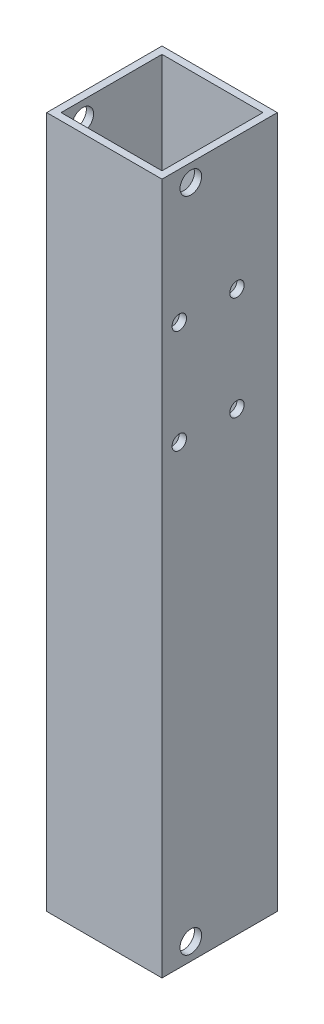
ISO-10303-21;
HEADER;
FILE_DESCRIPTION(('STEP AP214'),'2;1');
FILE_NAME('part.step','',(''),(''),'','','');
FILE_SCHEMA(('AUTOMOTIVE_DESIGN { 1 0 10303 214 1 1 1 1 }'));
ENDSEC;
DATA;
#1=APPLICATION_CONTEXT('core data for automotive mechanical design processes');
#2=APPLICATION_PROTOCOL_DEFINITION('international standard','automotive_design',2000,#1);
#3=PRODUCT_CONTEXT('',#1,'mechanical');
#4=PRODUCT('Part','Part','',(#3));
#5=PRODUCT_RELATED_PRODUCT_CATEGORY('part','',(#4));
#6=PRODUCT_DEFINITION_FORMATION('','',#4);
#7=PRODUCT_DEFINITION_CONTEXT('part definition',#1,'design');
#8=PRODUCT_DEFINITION('design','',#6,#7);
#9=PRODUCT_DEFINITION_SHAPE('','',#8);
#10=(LENGTH_UNIT() NAMED_UNIT(*) SI_UNIT(.MILLI.,.METRE.));
#11=(NAMED_UNIT(*) PLANE_ANGLE_UNIT() SI_UNIT($,.RADIAN.));
#12=(NAMED_UNIT(*) SI_UNIT($,.STERADIAN.) SOLID_ANGLE_UNIT());
#13=UNCERTAINTY_MEASURE_WITH_UNIT(LENGTH_MEASURE(1.E-05),#10,'distance_accuracy_value','');
#14=(GEOMETRIC_REPRESENTATION_CONTEXT(3) GLOBAL_UNCERTAINTY_ASSIGNED_CONTEXT((#13)) GLOBAL_UNIT_ASSIGNED_CONTEXT((#10,
#11,#12)) REPRESENTATION_CONTEXT('',''));
#15=CARTESIAN_POINT('',(0.,0.,0.));
#16=DIRECTION('',(0.,0.,1.));
#17=DIRECTION('',(1.,0.,0.));
#18=AXIS2_PLACEMENT_3D('',#15,#16,#17);
#19=CARTESIAN_POINT('',(63.3860498721177,-24.949645390071,25.4));
#20=DIRECTION('',(1.,0.,0.));
#21=DIRECTION('',(0.,1.,0.));
#22=AXIS2_PLACEMENT_3D('',#19,#20,#21);
#23=PLANE('',#22);
#24=CARTESIAN_POINT('',(63.3860498721177,-77.0196453900709,21.59));
#25=DIRECTION('',(1.,0.,0.));
#26=DIRECTION('',(0.,0.,-1.));
#27=AXIS2_PLACEMENT_3D('',#24,#25,#26);
#28=CIRCLE('',#27,1.58749999999999);
#29=CARTESIAN_POINT('',(63.3860498721177,-77.0196453900709,20.0025));
#30=VERTEX_POINT('',#29);
#31=EDGE_CURVE('E306',#30,#30,#28,.T.);
#32=ORIENTED_EDGE('',*,*,#31,.T.);
#33=EDGE_LOOP('',(#32));
#34=FACE_BOUND('',#33,.T.);
#35=CARTESIAN_POINT('',(63.3860498721177,-77.0196453900709,8.89));
#36=DIRECTION('',(1.,0.,0.));
#37=DIRECTION('',(0.,0.,-1.));
#38=AXIS2_PLACEMENT_3D('',#35,#36,#37);
#39=CIRCLE('',#38,1.58749999999999);
#40=CARTESIAN_POINT('',(63.3860498721177,-77.0196453900709,7.3025));
#41=VERTEX_POINT('',#40);
#42=EDGE_CURVE('E206',#41,#41,#39,.T.);
#43=ORIENTED_EDGE('',*,*,#42,.T.);
#44=EDGE_LOOP('',(#43));
#45=FACE_BOUND('',#44,.T.);
#46=CARTESIAN_POINT('',(63.3860498721177,-54.159645390071,21.59));
#47=DIRECTION('',(1.,0.,0.));
#48=DIRECTION('',(0.,0.,-1.));
#49=AXIS2_PLACEMENT_3D('',#46,#47,#48);
#50=CIRCLE('',#49,1.5875);
#51=CARTESIAN_POINT('',(63.3860498721177,-54.159645390071,20.0025));
#52=VERTEX_POINT('',#51);
#53=EDGE_CURVE('E228',#52,#52,#50,.T.);
#54=ORIENTED_EDGE('',*,*,#53,.T.);
#55=EDGE_LOOP('',(#54));
#56=FACE_BOUND('',#55,.T.);
#57=CARTESIAN_POINT('',(63.3860498721177,-54.159645390071,8.89));
#58=DIRECTION('',(1.,0.,0.));
#59=DIRECTION('',(0.,0.,-1.));
#60=AXIS2_PLACEMENT_3D('',#57,#58,#59);
#61=CIRCLE('',#60,1.5875);
#62=CARTESIAN_POINT('',(63.3860498721177,-54.159645390071,7.3025));
#63=VERTEX_POINT('',#62);
#64=EDGE_CURVE('E201',#63,#63,#61,.T.);
#65=ORIENTED_EDGE('',*,*,#64,.T.);
#66=EDGE_LOOP('',(#65));
#67=FACE_BOUND('',#66,.T.);
#68=CARTESIAN_POINT('',(63.3860498721177,-173.539645390071,19.05));
#69=DIRECTION('',(1.,0.,0.));
#70=DIRECTION('',(0.,0.,-1.));
#71=AXIS2_PLACEMENT_3D('',#68,#69,#70);
#72=CIRCLE('',#71,2.38125);
#73=CARTESIAN_POINT('',(63.3860498721177,-173.539645390071,16.66875));
#74=VERTEX_POINT('',#73);
#75=EDGE_CURVE('E196',#74,#74,#72,.T.);
#76=ORIENTED_EDGE('',*,*,#75,.T.);
#77=EDGE_LOOP('',(#76));
#78=FACE_BOUND('',#77,.T.);
#79=CARTESIAN_POINT('',(63.3860498721177,-28.759645390071,19.05));
#80=DIRECTION('',(1.,0.,0.));
#81=DIRECTION('',(0.,0.,-1.));
#82=AXIS2_PLACEMENT_3D('',#79,#80,#81);
#83=CIRCLE('',#82,2.38124999999999);
#84=CARTESIAN_POINT('',(63.3860498721177,-28.759645390071,16.66875));
#85=VERTEX_POINT('',#84);
#86=EDGE_CURVE('E264',#85,#85,#83,.T.);
#87=ORIENTED_EDGE('',*,*,#86,.T.);
#88=EDGE_LOOP('',(#87));
#89=FACE_BOUND('',#88,.T.);
#90=DIRECTION('',(0.,-1.,0.));
#91=VECTOR('',#90,1.);
#92=CARTESIAN_POINT('',(63.3860498721177,-24.949645390071,0.));
#93=LINE('',#92,#91);
#94=CARTESIAN_POINT('',(63.3860498721177,-24.949645390071,0.));
#95=VERTEX_POINT('',#94);
#96=CARTESIAN_POINT('',(63.3860498721177,-177.349645390071,0.));
#97=VERTEX_POINT('',#96);
#98=EDGE_CURVE('E154',#95,#97,#93,.T.);
#99=ORIENTED_EDGE('',*,*,#98,.T.);
#100=DIRECTION('',(0.,0.,-1.));
#101=VECTOR('',#100,1.);
#102=CARTESIAN_POINT('',(63.3860498721177,-177.349645390071,25.4));
#103=LINE('',#102,#101);
#104=CARTESIAN_POINT('',(63.3860498721177,-177.349645390071,25.4));
#105=VERTEX_POINT('',#104);
#106=EDGE_CURVE('E11',#105,#97,#103,.T.);
#107=ORIENTED_EDGE('',*,*,#106,.F.);
#108=DIRECTION('',(0.,-1.,0.));
#109=VECTOR('',#108,1.);
#110=CARTESIAN_POINT('',(63.3860498721177,-24.949645390071,25.4));
#111=LINE('',#110,#109);
#112=CARTESIAN_POINT('',(63.3860498721177,-24.949645390071,25.4));
#113=VERTEX_POINT('',#112);
#114=EDGE_CURVE('E155',#113,#105,#111,.T.);
#115=ORIENTED_EDGE('',*,*,#114,.F.);
#116=DIRECTION('',(0.,0.,-1.));
#117=VECTOR('',#116,1.);
#118=CARTESIAN_POINT('',(63.3860498721177,-24.949645390071,25.4));
#119=LINE('',#118,#117);
#120=EDGE_CURVE('E169',#113,#95,#119,.T.);
#121=ORIENTED_EDGE('',*,*,#120,.T.);
#122=EDGE_LOOP('',(#99,#107,#115,#121));
#123=FACE_BOUND('',#122,.T.);
#124=ADVANCED_FACE('F39',(#34,#45,#56,#67,#78,#89,#123),#23,.F.);
#125=CARTESIAN_POINT('',(63.3860498721177,-177.349645390071,25.4));
#126=DIRECTION('',(0.,1.,0.));
#127=DIRECTION('',(0.,0.,1.));
#128=AXIS2_PLACEMENT_3D('',#125,#126,#127);
#129=PLANE('',#128);
#130=DIRECTION('',(-1.,0.,0.));
#131=VECTOR('',#130,1.);
#132=CARTESIAN_POINT('',(63.3860498721177,-177.349645390071,1.58749999999999));
#133=LINE('',#132,#131);
#134=CARTESIAN_POINT('',(87.1985498721177,-177.349645390071,1.58750000000001));
#135=VERTEX_POINT('',#134);
#136=CARTESIAN_POINT('',(64.9735498721177,-177.349645390071,1.58750000000001));
#137=VERTEX_POINT('',#136);
#138=EDGE_CURVE('E146',#135,#137,#133,.T.);
#139=ORIENTED_EDGE('',*,*,#138,.T.);
#140=DIRECTION('',(0.,0.,1.));
#141=VECTOR('',#140,1.);
#142=CARTESIAN_POINT('',(64.9735498721177,-177.349645390071,25.4));
#143=LINE('',#142,#141);
#144=CARTESIAN_POINT('',(64.9735498721177,-177.349645390071,23.8125));
#145=VERTEX_POINT('',#144);
#146=EDGE_CURVE('E150',#137,#145,#143,.T.);
#147=ORIENTED_EDGE('',*,*,#146,.T.);
#148=DIRECTION('',(1.,0.,0.));
#149=VECTOR('',#148,1.);
#150=CARTESIAN_POINT('',(63.3860498721177,-177.349645390071,23.8125));
#151=LINE('',#150,#149);
#152=CARTESIAN_POINT('',(87.1985498721177,-177.349645390071,23.8125));
#153=VERTEX_POINT('',#152);
#154=EDGE_CURVE('E137',#145,#153,#151,.T.);
#155=ORIENTED_EDGE('',*,*,#154,.T.);
#156=DIRECTION('',(0.,0.,-1.));
#157=VECTOR('',#156,1.);
#158=CARTESIAN_POINT('',(87.1985498721177,-177.349645390071,25.4));
#159=LINE('',#158,#157);
#160=EDGE_CURVE('E112',#153,#135,#159,.T.);
#161=ORIENTED_EDGE('',*,*,#160,.T.);
#162=EDGE_LOOP('',(#139,#147,#155,#161));
#163=FACE_BOUND('',#162,.T.);
#164=DIRECTION('',(1.,0.,0.));
#165=VECTOR('',#164,1.);
#166=CARTESIAN_POINT('',(63.3860498721177,-177.349645390071,0.));
#167=LINE('',#166,#165);
#168=CARTESIAN_POINT('',(88.7860498721177,-177.349645390071,0.));
#169=VERTEX_POINT('',#168);
#170=EDGE_CURVE('E173',#97,#169,#167,.T.);
#171=ORIENTED_EDGE('',*,*,#170,.T.);
#172=DIRECTION('',(0.,0.,-1.));
#173=VECTOR('',#172,1.);
#174=CARTESIAN_POINT('',(88.7860498721177,-177.349645390071,25.4));
#175=LINE('',#174,#173);
#176=CARTESIAN_POINT('',(88.7860498721177,-177.349645390071,25.4));
#177=VERTEX_POINT('',#176);
#178=EDGE_CURVE('E48',#177,#169,#175,.T.);
#179=ORIENTED_EDGE('',*,*,#178,.F.);
#180=DIRECTION('',(1.,0.,0.));
#181=VECTOR('',#180,1.);
#182=CARTESIAN_POINT('',(63.3860498721177,-177.349645390071,25.4));
#183=LINE('',#182,#181);
#184=EDGE_CURVE('E159',#105,#177,#183,.T.);
#185=ORIENTED_EDGE('',*,*,#184,.F.);
#186=ORIENTED_EDGE('',*,*,#106,.T.);
#187=EDGE_LOOP('',(#171,#179,#185,#186));
#188=FACE_BOUND('',#187,.T.);
#189=ADVANCED_FACE('F297',(#163,#188),#129,.F.);
#190=CARTESIAN_POINT('',(88.7860498721177,-24.949645390071,25.4));
#191=DIRECTION('',(-1.,0.,0.));
#192=DIRECTION('',(0.,-1.,0.));
#193=AXIS2_PLACEMENT_3D('',#190,#191,#192);
#194=PLANE('',#193);
#195=CARTESIAN_POINT('',(88.7860498721177,-77.0196453900709,21.59));
#196=DIRECTION('',(1.,0.,0.));
#197=DIRECTION('',(0.,0.,-1.));
#198=AXIS2_PLACEMENT_3D('',#195,#196,#197);
#199=CIRCLE('',#198,1.58750000000001);
#200=CARTESIAN_POINT('',(88.7860498721177,-77.0196453900709,20.0025));
#201=VERTEX_POINT('',#200);
#202=EDGE_CURVE('E455',#201,#201,#199,.T.);
#203=ORIENTED_EDGE('',*,*,#202,.F.);
#204=EDGE_LOOP('',(#203));
#205=FACE_BOUND('',#204,.T.);
#206=CARTESIAN_POINT('',(88.7860498721177,-77.0196453900709,8.89));
#207=DIRECTION('',(1.,0.,0.));
#208=DIRECTION('',(0.,0.,-1.));
#209=AXIS2_PLACEMENT_3D('',#206,#207,#208);
#210=CIRCLE('',#209,1.58750000000001);
#211=CARTESIAN_POINT('',(88.7860498721177,-77.0196453900709,7.30249999999999));
#212=VERTEX_POINT('',#211);
#213=EDGE_CURVE('E215',#212,#212,#210,.T.);
#214=ORIENTED_EDGE('',*,*,#213,.F.);
#215=EDGE_LOOP('',(#214));
#216=FACE_BOUND('',#215,.T.);
#217=CARTESIAN_POINT('',(88.7860498721177,-54.159645390071,21.59));
#218=DIRECTION('',(1.,0.,0.));
#219=DIRECTION('',(0.,0.,-1.));
#220=AXIS2_PLACEMENT_3D('',#217,#218,#219);
#221=CIRCLE('',#220,1.5875);
#222=CARTESIAN_POINT('',(88.7860498721177,-54.159645390071,20.0025));
#223=VERTEX_POINT('',#222);
#224=EDGE_CURVE('E212',#223,#223,#221,.T.);
#225=ORIENTED_EDGE('',*,*,#224,.F.);
#226=EDGE_LOOP('',(#225));
#227=FACE_BOUND('',#226,.T.);
#228=CARTESIAN_POINT('',(88.7860498721177,-54.159645390071,8.89));
#229=DIRECTION('',(1.,0.,0.));
#230=DIRECTION('',(0.,0.,-1.));
#231=AXIS2_PLACEMENT_3D('',#228,#229,#230);
#232=CIRCLE('',#231,1.5875);
#233=CARTESIAN_POINT('',(88.7860498721177,-54.159645390071,7.3025));
#234=VERTEX_POINT('',#233);
#235=EDGE_CURVE('E240',#234,#234,#232,.T.);
#236=ORIENTED_EDGE('',*,*,#235,.F.);
#237=EDGE_LOOP('',(#236));
#238=FACE_BOUND('',#237,.T.);
#239=CARTESIAN_POINT('',(88.7860498721177,-173.539645390071,19.05));
#240=DIRECTION('',(1.,0.,0.));
#241=DIRECTION('',(0.,0.,-1.));
#242=AXIS2_PLACEMENT_3D('',#239,#240,#241);
#243=CIRCLE('',#242,2.38124999999997);
#244=CARTESIAN_POINT('',(88.7860498721177,-173.539645390071,16.66875));
#245=VERTEX_POINT('',#244);
#246=EDGE_CURVE('E250',#245,#245,#243,.T.);
#247=ORIENTED_EDGE('',*,*,#246,.F.);
#248=EDGE_LOOP('',(#247));
#249=FACE_BOUND('',#248,.T.);
#250=CARTESIAN_POINT('',(88.7860498721177,-28.759645390071,19.05));
#251=DIRECTION('',(1.,0.,0.));
#252=DIRECTION('',(0.,0.,-1.));
#253=AXIS2_PLACEMENT_3D('',#250,#251,#252);
#254=CIRCLE('',#253,2.38124999999999);
#255=CARTESIAN_POINT('',(88.7860498721177,-28.759645390071,16.66875));
#256=VERTEX_POINT('',#255);
#257=EDGE_CURVE('E260',#256,#256,#254,.T.);
#258=ORIENTED_EDGE('',*,*,#257,.F.);
#259=EDGE_LOOP('',(#258));
#260=FACE_BOUND('',#259,.T.);
#261=DIRECTION('',(0.,1.,0.));
#262=VECTOR('',#261,1.);
#263=CARTESIAN_POINT('',(88.7860498721177,-24.949645390071,0.));
#264=LINE('',#263,#262);
#265=CARTESIAN_POINT('',(88.7860498721177,-24.949645390071,0.));
#266=VERTEX_POINT('',#265);
#267=EDGE_CURVE('E176',#169,#266,#264,.T.);
#268=ORIENTED_EDGE('',*,*,#267,.T.);
#269=DIRECTION('',(0.,0.,-1.));
#270=VECTOR('',#269,1.);
#271=CARTESIAN_POINT('',(88.7860498721177,-24.949645390071,25.4));
#272=LINE('',#271,#270);
#273=CARTESIAN_POINT('',(88.7860498721177,-24.949645390071,25.4));
#274=VERTEX_POINT('',#273);
#275=EDGE_CURVE('E184',#274,#266,#272,.T.);
#276=ORIENTED_EDGE('',*,*,#275,.F.);
#277=DIRECTION('',(0.,1.,0.));
#278=VECTOR('',#277,1.);
#279=CARTESIAN_POINT('',(88.7860498721177,-24.949645390071,25.4));
#280=LINE('',#279,#278);
#281=EDGE_CURVE('E163',#177,#274,#280,.T.);
#282=ORIENTED_EDGE('',*,*,#281,.F.);
#283=ORIENTED_EDGE('',*,*,#178,.T.);
#284=EDGE_LOOP('',(#268,#276,#282,#283));
#285=FACE_BOUND('',#284,.T.);
#286=ADVANCED_FACE('F302',(#205,#216,#227,#238,#249,#260,#285),#194,.F.);
#287=CARTESIAN_POINT('',(63.3860498721177,-24.949645390071,25.4));
#288=DIRECTION('',(0.,-1.,0.));
#289=DIRECTION('',(0.,0.,-1.));
#290=AXIS2_PLACEMENT_3D('',#287,#288,#289);
#291=PLANE('',#290);
#292=DIRECTION('',(1.,0.,0.));
#293=VECTOR('',#292,1.);
#294=CARTESIAN_POINT('',(64.9735498721177,-24.949645390071,23.8125));
#295=LINE('',#294,#293);
#296=CARTESIAN_POINT('',(64.9735498721177,-24.949645390071,23.8125));
#297=VERTEX_POINT('',#296);
#298=CARTESIAN_POINT('',(87.1985498721177,-24.949645390071,23.8125));
#299=VERTEX_POINT('',#298);
#300=EDGE_CURVE('E119',#297,#299,#295,.T.);
#301=ORIENTED_EDGE('',*,*,#300,.F.);
#302=DIRECTION('',(0.,0.,1.));
#303=VECTOR('',#302,1.);
#304=CARTESIAN_POINT('',(64.9735498721177,-24.949645390071,23.8125));
#305=LINE('',#304,#303);
#306=CARTESIAN_POINT('',(64.9735498721177,-24.949645390071,1.58750000000001));
#307=VERTEX_POINT('',#306);
#308=EDGE_CURVE('E64',#307,#297,#305,.T.);
#309=ORIENTED_EDGE('',*,*,#308,.F.);
#310=DIRECTION('',(-1.,0.,0.));
#311=VECTOR('',#310,1.);
#312=CARTESIAN_POINT('',(64.9735498721177,-24.949645390071,1.58750000000001));
#313=LINE('',#312,#311);
#314=CARTESIAN_POINT('',(87.1985498721177,-24.949645390071,1.58750000000001));
#315=VERTEX_POINT('',#314);
#316=EDGE_CURVE('E127',#315,#307,#313,.T.);
#317=ORIENTED_EDGE('',*,*,#316,.F.);
#318=DIRECTION('',(0.,0.,-1.));
#319=VECTOR('',#318,1.);
#320=CARTESIAN_POINT('',(87.1985498721177,-24.949645390071,23.8125));
#321=LINE('',#320,#319);
#322=EDGE_CURVE('E109',#299,#315,#321,.T.);
#323=ORIENTED_EDGE('',*,*,#322,.F.);
#324=EDGE_LOOP('',(#301,#309,#317,#323));
#325=FACE_BOUND('',#324,.T.);
#326=DIRECTION('',(-1.,0.,0.));
#327=VECTOR('',#326,1.);
#328=CARTESIAN_POINT('',(63.3860498721177,-24.949645390071,0.));
#329=LINE('',#328,#327);
#330=EDGE_CURVE('E160',#266,#95,#329,.T.);
#331=ORIENTED_EDGE('',*,*,#330,.T.);
#332=ORIENTED_EDGE('',*,*,#120,.F.);
#333=DIRECTION('',(-1.,0.,0.));
#334=VECTOR('',#333,1.);
#335=CARTESIAN_POINT('',(63.3860498721177,-24.949645390071,25.4));
#336=LINE('',#335,#334);
#337=EDGE_CURVE('E166',#274,#113,#336,.T.);
#338=ORIENTED_EDGE('',*,*,#337,.F.);
#339=ORIENTED_EDGE('',*,*,#275,.T.);
#340=EDGE_LOOP('',(#331,#332,#338,#339));
#341=FACE_BOUND('',#340,.T.);
#342=ADVANCED_FACE('F124',(#325,#341),#291,.F.);
#343=CARTESIAN_POINT('',(0.,0.,25.4));
#344=DIRECTION('',(0.,0.,1.));
#345=DIRECTION('',(1.,0.,0.));
#346=AXIS2_PLACEMENT_3D('',#343,#344,#345);
#347=PLANE('',#346);
#348=ORIENTED_EDGE('',*,*,#114,.T.);
#349=ORIENTED_EDGE('',*,*,#184,.T.);
#350=ORIENTED_EDGE('',*,*,#281,.T.);
#351=ORIENTED_EDGE('',*,*,#337,.T.);
#352=EDGE_LOOP('',(#348,#349,#350,#351));
#353=FACE_BOUND('',#352,.T.);
#354=ADVANCED_FACE('F327',(#353),#347,.T.);
#355=CARTESIAN_POINT('',(0.,0.,0.));
#356=DIRECTION('',(0.,0.,1.));
#357=DIRECTION('',(1.,0.,0.));
#358=AXIS2_PLACEMENT_3D('',#355,#356,#357);
#359=PLANE('',#358);
#360=ORIENTED_EDGE('',*,*,#98,.F.);
#361=ORIENTED_EDGE('',*,*,#330,.F.);
#362=ORIENTED_EDGE('',*,*,#267,.F.);
#363=ORIENTED_EDGE('',*,*,#170,.F.);
#364=EDGE_LOOP('',(#360,#361,#362,#363));
#365=FACE_BOUND('',#364,.T.);
#366=ADVANCED_FACE('F321',(#365),#359,.F.);
#367=CARTESIAN_POINT('',(64.9735498721177,-304.349645390071,23.8125));
#368=DIRECTION('',(-1.,0.,0.));
#369=DIRECTION('',(0.,0.,1.));
#370=AXIS2_PLACEMENT_3D('',#367,#368,#369);
#371=PLANE('',#370);
#372=CARTESIAN_POINT('',(64.9735498721177,-77.0196453900709,21.59));
#373=DIRECTION('',(-1.,0.,0.));
#374=DIRECTION('',(0.,0.,1.));
#375=AXIS2_PLACEMENT_3D('',#372,#373,#374);
#376=CIRCLE('',#375,1.5875);
#377=CARTESIAN_POINT('',(64.9735498721177,-77.0196453900709,23.1775));
#378=VERTEX_POINT('',#377);
#379=EDGE_CURVE('E221',#378,#378,#376,.T.);
#380=ORIENTED_EDGE('',*,*,#379,.T.);
#381=EDGE_LOOP('',(#380));
#382=FACE_BOUND('',#381,.T.);
#383=CARTESIAN_POINT('',(64.9735498721177,-77.0196453900709,8.89));
#384=DIRECTION('',(-1.,0.,0.));
#385=DIRECTION('',(0.,0.,1.));
#386=AXIS2_PLACEMENT_3D('',#383,#384,#385);
#387=CIRCLE('',#386,1.5875);
#388=CARTESIAN_POINT('',(64.9735498721177,-77.0196453900709,10.4775));
#389=VERTEX_POINT('',#388);
#390=EDGE_CURVE('E205',#389,#389,#387,.T.);
#391=ORIENTED_EDGE('',*,*,#390,.T.);
#392=EDGE_LOOP('',(#391));
#393=FACE_BOUND('',#392,.T.);
#394=CARTESIAN_POINT('',(64.9735498721177,-54.159645390071,21.59));
#395=DIRECTION('',(-1.,0.,0.));
#396=DIRECTION('',(0.,0.,1.));
#397=AXIS2_PLACEMENT_3D('',#394,#395,#396);
#398=CIRCLE('',#397,1.5875);
#399=CARTESIAN_POINT('',(64.9735498721177,-54.159645390071,23.1775));
#400=VERTEX_POINT('',#399);
#401=EDGE_CURVE('E236',#400,#400,#398,.T.);
#402=ORIENTED_EDGE('',*,*,#401,.T.);
#403=EDGE_LOOP('',(#402));
#404=FACE_BOUND('',#403,.T.);
#405=CARTESIAN_POINT('',(64.9735498721177,-54.159645390071,8.89));
#406=DIRECTION('',(-1.,0.,0.));
#407=DIRECTION('',(0.,0.,1.));
#408=AXIS2_PLACEMENT_3D('',#405,#406,#407);
#409=CIRCLE('',#408,1.5875);
#410=CARTESIAN_POINT('',(64.9735498721177,-54.159645390071,10.4775));
#411=VERTEX_POINT('',#410);
#412=EDGE_CURVE('E200',#411,#411,#409,.T.);
#413=ORIENTED_EDGE('',*,*,#412,.T.);
#414=EDGE_LOOP('',(#413));
#415=FACE_BOUND('',#414,.T.);
#416=CARTESIAN_POINT('',(64.9735498721177,-173.539645390071,19.05));
#417=DIRECTION('',(-1.,0.,0.));
#418=DIRECTION('',(0.,0.,1.));
#419=AXIS2_PLACEMENT_3D('',#416,#417,#418);
#420=CIRCLE('',#419,2.38124999999999);
#421=CARTESIAN_POINT('',(64.9735498721177,-173.539645390071,21.43125));
#422=VERTEX_POINT('',#421);
#423=EDGE_CURVE('E195',#422,#422,#420,.T.);
#424=ORIENTED_EDGE('',*,*,#423,.T.);
#425=EDGE_LOOP('',(#424));
#426=FACE_BOUND('',#425,.T.);
#427=CARTESIAN_POINT('',(64.9735498721177,-28.759645390071,19.05));
#428=DIRECTION('',(-1.,0.,0.));
#429=DIRECTION('',(0.,0.,1.));
#430=AXIS2_PLACEMENT_3D('',#427,#428,#429);
#431=CIRCLE('',#430,2.38124999999999);
#432=CARTESIAN_POINT('',(64.9735498721177,-28.759645390071,21.43125));
#433=VERTEX_POINT('',#432);
#434=EDGE_CURVE('E272',#433,#433,#431,.T.);
#435=ORIENTED_EDGE('',*,*,#434,.T.);
#436=EDGE_LOOP('',(#435));
#437=FACE_BOUND('',#436,.T.);
#438=DIRECTION('',(0.,1.,0.));
#439=VECTOR('',#438,1.);
#440=CARTESIAN_POINT('',(64.9735498721177,-304.349645390071,1.58750000000001));
#441=LINE('',#440,#439);
#442=EDGE_CURVE('E134',#137,#307,#441,.T.);
#443=ORIENTED_EDGE('',*,*,#442,.T.);
#444=ORIENTED_EDGE('',*,*,#308,.T.);
#445=DIRECTION('',(0.,1.,0.));
#446=VECTOR('',#445,1.);
#447=CARTESIAN_POINT('',(64.9735498721177,-304.349645390071,23.8125));
#448=LINE('',#447,#446);
#449=EDGE_CURVE('E116',#145,#297,#448,.T.);
#450=ORIENTED_EDGE('',*,*,#449,.F.);
#451=ORIENTED_EDGE('',*,*,#146,.F.);
#452=EDGE_LOOP('',(#443,#444,#450,#451));
#453=FACE_BOUND('',#452,.T.);
#454=ADVANCED_FACE('F278',(#382,#393,#404,#415,#426,#437,#453),#371,.F.);
#455=CARTESIAN_POINT('',(64.9735498721177,-304.349645390071,1.58750000000001));
#456=DIRECTION('',(0.,0.,-1.));
#457=DIRECTION('',(-1.,0.,0.));
#458=AXIS2_PLACEMENT_3D('',#455,#456,#457);
#459=PLANE('',#458);
#460=DIRECTION('',(0.,1.,0.));
#461=VECTOR('',#460,1.);
#462=CARTESIAN_POINT('',(87.1985498721177,-304.349645390071,1.58750000000001));
#463=LINE('',#462,#461);
#464=EDGE_CURVE('E115',#135,#315,#463,.T.);
#465=ORIENTED_EDGE('',*,*,#464,.T.);
#466=ORIENTED_EDGE('',*,*,#316,.T.);
#467=ORIENTED_EDGE('',*,*,#442,.F.);
#468=ORIENTED_EDGE('',*,*,#138,.F.);
#469=EDGE_LOOP('',(#465,#466,#467,#468));
#470=FACE_BOUND('',#469,.T.);
#471=ADVANCED_FACE('F347',(#470),#459,.F.);
#472=CARTESIAN_POINT('',(87.1985498721177,-304.349645390071,23.8125));
#473=DIRECTION('',(1.,0.,0.));
#474=DIRECTION('',(0.,0.,-1.));
#475=AXIS2_PLACEMENT_3D('',#472,#473,#474);
#476=PLANE('',#475);
#477=CARTESIAN_POINT('',(87.1985498721177,-77.0196453900709,21.59));
#478=DIRECTION('',(1.,0.,0.));
#479=DIRECTION('',(0.,0.,-1.));
#480=AXIS2_PLACEMENT_3D('',#477,#478,#479);
#481=CIRCLE('',#480,1.5875);
#482=CARTESIAN_POINT('',(87.1985498721177,-77.0196453900709,20.0025));
#483=VERTEX_POINT('',#482);
#484=EDGE_CURVE('E42',#483,#483,#481,.T.);
#485=ORIENTED_EDGE('',*,*,#484,.T.);
#486=EDGE_LOOP('',(#485));
#487=FACE_BOUND('',#486,.T.);
#488=CARTESIAN_POINT('',(87.1985498721177,-77.0196453900709,8.89));
#489=DIRECTION('',(1.,0.,0.));
#490=DIRECTION('',(0.,0.,-1.));
#491=AXIS2_PLACEMENT_3D('',#488,#489,#490);
#492=CIRCLE('',#491,1.5875);
#493=CARTESIAN_POINT('',(87.1985498721177,-77.0196453900709,7.3025));
#494=VERTEX_POINT('',#493);
#495=EDGE_CURVE('E202',#494,#494,#492,.T.);
#496=ORIENTED_EDGE('',*,*,#495,.T.);
#497=EDGE_LOOP('',(#496));
#498=FACE_BOUND('',#497,.T.);
#499=CARTESIAN_POINT('',(87.1985498721177,-54.159645390071,21.59));
#500=DIRECTION('',(1.,0.,0.));
#501=DIRECTION('',(0.,0.,-1.));
#502=AXIS2_PLACEMENT_3D('',#499,#500,#501);
#503=CIRCLE('',#502,1.5875);
#504=CARTESIAN_POINT('',(87.1985498721177,-54.159645390071,20.0025));
#505=VERTEX_POINT('',#504);
#506=EDGE_CURVE('E232',#505,#505,#503,.T.);
#507=ORIENTED_EDGE('',*,*,#506,.T.);
#508=EDGE_LOOP('',(#507));
#509=FACE_BOUND('',#508,.T.);
#510=CARTESIAN_POINT('',(87.1985498721177,-54.159645390071,8.89));
#511=DIRECTION('',(1.,0.,0.));
#512=DIRECTION('',(0.,0.,-1.));
#513=AXIS2_PLACEMENT_3D('',#510,#511,#512);
#514=CIRCLE('',#513,1.5875);
#515=CARTESIAN_POINT('',(87.1985498721177,-54.159645390071,7.3025));
#516=VERTEX_POINT('',#515);
#517=EDGE_CURVE('E197',#516,#516,#514,.T.);
#518=ORIENTED_EDGE('',*,*,#517,.T.);
#519=EDGE_LOOP('',(#518));
#520=FACE_BOUND('',#519,.T.);
#521=CARTESIAN_POINT('',(87.1985498721177,-173.539645390071,19.05));
#522=DIRECTION('',(1.,0.,0.));
#523=DIRECTION('',(0.,0.,-1.));
#524=AXIS2_PLACEMENT_3D('',#521,#522,#523);
#525=CIRCLE('',#524,2.38124999999999);
#526=CARTESIAN_POINT('',(87.1985498721177,-173.539645390071,16.66875));
#527=VERTEX_POINT('',#526);
#528=EDGE_CURVE('E191',#527,#527,#525,.T.);
#529=ORIENTED_EDGE('',*,*,#528,.T.);
#530=EDGE_LOOP('',(#529));
#531=FACE_BOUND('',#530,.T.);
#532=CARTESIAN_POINT('',(87.1985498721177,-28.759645390071,19.05));
#533=DIRECTION('',(1.,0.,0.));
#534=DIRECTION('',(0.,0.,-1.));
#535=AXIS2_PLACEMENT_3D('',#532,#533,#534);
#536=CIRCLE('',#535,2.38124999999999);
#537=CARTESIAN_POINT('',(87.1985498721177,-28.759645390071,16.66875));
#538=VERTEX_POINT('',#537);
#539=EDGE_CURVE('E268',#538,#538,#536,.T.);
#540=ORIENTED_EDGE('',*,*,#539,.T.);
#541=EDGE_LOOP('',(#540));
#542=FACE_BOUND('',#541,.T.);
#543=DIRECTION('',(0.,1.,0.));
#544=VECTOR('',#543,1.);
#545=CARTESIAN_POINT('',(87.1985498721177,-304.349645390071,23.8125));
#546=LINE('',#545,#544);
#547=EDGE_CURVE('E56',#153,#299,#546,.T.);
#548=ORIENTED_EDGE('',*,*,#547,.T.);
#549=ORIENTED_EDGE('',*,*,#322,.T.);
#550=ORIENTED_EDGE('',*,*,#464,.F.);
#551=ORIENTED_EDGE('',*,*,#160,.F.);
#552=EDGE_LOOP('',(#548,#549,#550,#551));
#553=FACE_BOUND('',#552,.T.);
#554=ADVANCED_FACE('F106',(#487,#498,#509,#520,#531,#542,#553),#476,.F.);
#555=CARTESIAN_POINT('',(64.9735498721177,-304.349645390071,23.8125));
#556=DIRECTION('',(0.,0.,1.));
#557=DIRECTION('',(1.,0.,0.));
#558=AXIS2_PLACEMENT_3D('',#555,#556,#557);
#559=PLANE('',#558);
#560=ORIENTED_EDGE('',*,*,#449,.T.);
#561=ORIENTED_EDGE('',*,*,#300,.T.);
#562=ORIENTED_EDGE('',*,*,#547,.F.);
#563=ORIENTED_EDGE('',*,*,#154,.F.);
#564=EDGE_LOOP('',(#560,#561,#562,#563));
#565=FACE_BOUND('',#564,.T.);
#566=ADVANCED_FACE('F120',(#565),#559,.F.);
#567=CARTESIAN_POINT('',(88.7860498721177,-28.759645390071,19.05));
#568=DIRECTION('',(1.,0.,0.));
#569=DIRECTION('',(0.,0.,-1.));
#570=AXIS2_PLACEMENT_3D('',#567,#568,#569);
#571=CYLINDRICAL_SURFACE('',#570,2.38124999999999);
#572=ORIENTED_EDGE('',*,*,#257,.T.);
#573=EDGE_LOOP('',(#572));
#574=FACE_BOUND('',#573,.T.);
#575=ORIENTED_EDGE('',*,*,#539,.F.);
#576=EDGE_LOOP('',(#575));
#577=FACE_BOUND('',#576,.T.);
#578=ADVANCED_FACE('F283',(#574,#577),#571,.F.);
#579=ORIENTED_EDGE('',*,*,#86,.F.);
#580=EDGE_LOOP('',(#579));
#581=FACE_BOUND('',#580,.T.);
#582=ORIENTED_EDGE('',*,*,#434,.F.);
#583=EDGE_LOOP('',(#582));
#584=FACE_BOUND('',#583,.T.);
#585=ADVANCED_FACE('F280',(#581,#584),#571,.F.);
#586=CARTESIAN_POINT('',(88.7860498721177,-173.539645390071,19.05));
#587=DIRECTION('',(1.,0.,0.));
#588=DIRECTION('',(0.,0.,-1.));
#589=AXIS2_PLACEMENT_3D('',#586,#587,#588);
#590=CYLINDRICAL_SURFACE('',#589,2.38124999999999);
#591=ORIENTED_EDGE('',*,*,#246,.T.);
#592=EDGE_LOOP('',(#591));
#593=FACE_BOUND('',#592,.T.);
#594=ORIENTED_EDGE('',*,*,#528,.F.);
#595=EDGE_LOOP('',(#594));
#596=FACE_BOUND('',#595,.T.);
#597=ADVANCED_FACE('F282',(#593,#596),#590,.F.);
#598=ORIENTED_EDGE('',*,*,#75,.F.);
#599=EDGE_LOOP('',(#598));
#600=FACE_BOUND('',#599,.T.);
#601=ORIENTED_EDGE('',*,*,#423,.F.);
#602=EDGE_LOOP('',(#601));
#603=FACE_BOUND('',#602,.T.);
#604=ADVANCED_FACE('F290',(#600,#603),#590,.F.);
#605=CARTESIAN_POINT('',(88.7860498721177,-54.159645390071,8.89));
#606=DIRECTION('',(1.,0.,0.));
#607=DIRECTION('',(0.,0.,-1.));
#608=AXIS2_PLACEMENT_3D('',#605,#606,#607);
#609=CYLINDRICAL_SURFACE('',#608,1.5875);
#610=ORIENTED_EDGE('',*,*,#235,.T.);
#611=EDGE_LOOP('',(#610));
#612=FACE_BOUND('',#611,.T.);
#613=ORIENTED_EDGE('',*,*,#517,.F.);
#614=EDGE_LOOP('',(#613));
#615=FACE_BOUND('',#614,.T.);
#616=ADVANCED_FACE('F385',(#612,#615),#609,.F.);
#617=ORIENTED_EDGE('',*,*,#64,.F.);
#618=EDGE_LOOP('',(#617));
#619=FACE_BOUND('',#618,.T.);
#620=ORIENTED_EDGE('',*,*,#412,.F.);
#621=EDGE_LOOP('',(#620));
#622=FACE_BOUND('',#621,.T.);
#623=ADVANCED_FACE('F392',(#619,#622),#609,.F.);
#624=CARTESIAN_POINT('',(88.7860498721177,-54.159645390071,21.59));
#625=DIRECTION('',(1.,0.,0.));
#626=DIRECTION('',(0.,0.,-1.));
#627=AXIS2_PLACEMENT_3D('',#624,#625,#626);
#628=CYLINDRICAL_SURFACE('',#627,1.5875);
#629=ORIENTED_EDGE('',*,*,#224,.T.);
#630=EDGE_LOOP('',(#629));
#631=FACE_BOUND('',#630,.T.);
#632=ORIENTED_EDGE('',*,*,#506,.F.);
#633=EDGE_LOOP('',(#632));
#634=FACE_BOUND('',#633,.T.);
#635=ADVANCED_FACE('F400',(#631,#634),#628,.F.);
#636=ORIENTED_EDGE('',*,*,#53,.F.);
#637=EDGE_LOOP('',(#636));
#638=FACE_BOUND('',#637,.T.);
#639=ORIENTED_EDGE('',*,*,#401,.F.);
#640=EDGE_LOOP('',(#639));
#641=FACE_BOUND('',#640,.T.);
#642=ADVANCED_FACE('F407',(#638,#641),#628,.F.);
#643=CARTESIAN_POINT('',(88.7860498721177,-77.0196453900709,8.89));
#644=DIRECTION('',(1.,0.,0.));
#645=DIRECTION('',(0.,0.,-1.));
#646=AXIS2_PLACEMENT_3D('',#643,#644,#645);
#647=CYLINDRICAL_SURFACE('',#646,1.5875);
#648=ORIENTED_EDGE('',*,*,#213,.T.);
#649=EDGE_LOOP('',(#648));
#650=FACE_BOUND('',#649,.T.);
#651=ORIENTED_EDGE('',*,*,#495,.F.);
#652=EDGE_LOOP('',(#651));
#653=FACE_BOUND('',#652,.T.);
#654=ADVANCED_FACE('F415',(#650,#653),#647,.F.);
#655=ORIENTED_EDGE('',*,*,#42,.F.);
#656=EDGE_LOOP('',(#655));
#657=FACE_BOUND('',#656,.T.);
#658=ORIENTED_EDGE('',*,*,#390,.F.);
#659=EDGE_LOOP('',(#658));
#660=FACE_BOUND('',#659,.T.);
#661=ADVANCED_FACE('F422',(#657,#660),#647,.F.);
#662=CARTESIAN_POINT('',(88.7860498721177,-77.0196453900709,21.59));
#663=DIRECTION('',(1.,0.,0.));
#664=DIRECTION('',(0.,0.,-1.));
#665=AXIS2_PLACEMENT_3D('',#662,#663,#664);
#666=CYLINDRICAL_SURFACE('',#665,1.5875);
#667=ORIENTED_EDGE('',*,*,#202,.T.);
#668=EDGE_LOOP('',(#667));
#669=FACE_BOUND('',#668,.T.);
#670=ORIENTED_EDGE('',*,*,#484,.F.);
#671=EDGE_LOOP('',(#670));
#672=FACE_BOUND('',#671,.T.);
#673=ADVANCED_FACE('F430',(#669,#672),#666,.F.);
#674=ORIENTED_EDGE('',*,*,#31,.F.);
#675=EDGE_LOOP('',(#674));
#676=FACE_BOUND('',#675,.T.);
#677=ORIENTED_EDGE('',*,*,#379,.F.);
#678=EDGE_LOOP('',(#677));
#679=FACE_BOUND('',#678,.T.);
#680=ADVANCED_FACE('F437',(#676,#679),#666,.F.);
#681=CLOSED_SHELL('',(#124,#189,#286,#342,#354,#366,#454,#471,#554,#566,#578,#585,#597,#604,
#616,#623,#635,#642,#654,#661,#673,#680));
#682=MANIFOLD_SOLID_BREP('B2',#681);
#683=ADVANCED_BREP_SHAPE_REPRESENTATION('',(#18,#682),#14);
#684=SHAPE_DEFINITION_REPRESENTATION(#9,#683);
ENDSEC;
END-ISO-10303-21;
